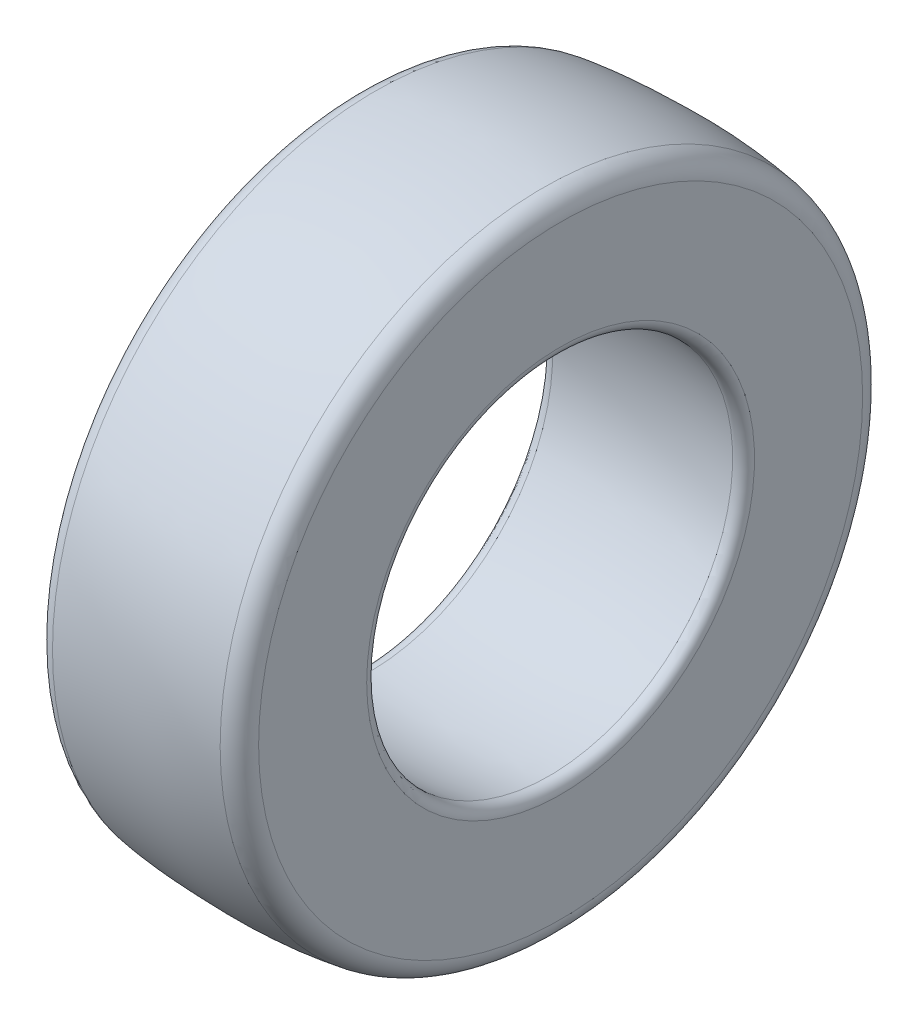
ISO-10303-21;
HEADER;
FILE_DESCRIPTION(('STEP AP214'),'2;1');
FILE_NAME('part.step','',(''),(''),'','','');
FILE_SCHEMA(('AUTOMOTIVE_DESIGN { 1 0 10303 214 1 1 1 1 }'));
ENDSEC;
DATA;
#1=APPLICATION_CONTEXT('core data for automotive mechanical design processes');
#2=APPLICATION_PROTOCOL_DEFINITION('international standard','automotive_design',2000,#1);
#3=PRODUCT_CONTEXT('',#1,'mechanical');
#4=PRODUCT('Part','Part','',(#3));
#5=PRODUCT_RELATED_PRODUCT_CATEGORY('part','',(#4));
#6=PRODUCT_DEFINITION_FORMATION('','',#4);
#7=PRODUCT_DEFINITION_CONTEXT('part definition',#1,'design');
#8=PRODUCT_DEFINITION('design','',#6,#7);
#9=PRODUCT_DEFINITION_SHAPE('','',#8);
#10=(LENGTH_UNIT() NAMED_UNIT(*) SI_UNIT(.MILLI.,.METRE.));
#11=(NAMED_UNIT(*) PLANE_ANGLE_UNIT() SI_UNIT($,.RADIAN.));
#12=(NAMED_UNIT(*) SI_UNIT($,.STERADIAN.) SOLID_ANGLE_UNIT());
#13=UNCERTAINTY_MEASURE_WITH_UNIT(LENGTH_MEASURE(1.E-05),#10,'distance_accuracy_value','');
#14=(GEOMETRIC_REPRESENTATION_CONTEXT(3) GLOBAL_UNCERTAINTY_ASSIGNED_CONTEXT((#13)) GLOBAL_UNIT_ASSIGNED_CONTEXT((#10,
#11,#12)) REPRESENTATION_CONTEXT('',''));
#15=CARTESIAN_POINT('',(0.,0.,0.));
#16=DIRECTION('',(0.,0.,1.));
#17=DIRECTION('',(1.,0.,0.));
#18=AXIS2_PLACEMENT_3D('',#15,#16,#17);
#19=CARTESIAN_POINT('',(8.03696229388294,0.273461296531756,0.));
#20=CARTESIAN_POINT('',(5.00041149086391,0.713704260185323,0.));
#21=CARTESIAN_POINT('',(1.53905645336523,0.9395684827717,0.));
#22=CARTESIAN_POINT('',(-5.70942025100693,0.635053509987881,0.));
#23=CARTESIAN_POINT('',(-8.04687623999241,0.284199065877852,0.));
#24=B_SPLINE_CURVE_WITH_KNOTS('',3,(#19,#20,#21,#22,#23),.UNSPECIFIED.,.F.,.F.,(4,1,4),
(0.0895013504530113,0.546617305205757,0.914231909505492),.UNSPECIFIED.);
#25=CARTESIAN_POINT('',(0.,-30.6972760772363,-2.44967934269345E-11));
#26=DIRECTION('',(-1.,0.,0.));
#27=AXIS1_PLACEMENT('',#25,#26);
#28=SURFACE_OF_REVOLUTION('',#24,#27);
#29=CARTESIAN_POINT('',(-8.04687623999241,-30.6972760772363,-2.44967934269345E-11));
#30=DIRECTION('',(-1.,0.,0.));
#31=DIRECTION('',(0.,0.,1.));
#32=AXIS2_PLACEMENT_3D('',#29,#30,#31);
#33=CIRCLE('',#32,30.9814751431141);
#34=CARTESIAN_POINT('',(-8.04687623999241,-30.6972760772363,30.9814751430896));
#35=VERTEX_POINT('',#34);
#36=EDGE_CURVE('E10',#35,#35,#33,.T.);
#37=ORIENTED_EDGE('',*,*,#36,.F.);
#38=EDGE_LOOP('',(#37));
#39=FACE_BOUND('',#38,.T.);
#40=CARTESIAN_POINT('',(8.03696229388294,-30.6972760772363,-2.44967934269345E-11));
#41=DIRECTION('',(-1.,0.,0.));
#42=DIRECTION('',(0.,0.,1.));
#43=AXIS2_PLACEMENT_3D('',#40,#41,#42);
#44=CIRCLE('',#43,30.970737373768);
#45=CARTESIAN_POINT('',(8.03696229388294,-30.6972760772363,30.9707373737435));
#46=VERTEX_POINT('',#45);
#47=EDGE_CURVE('E61',#46,#46,#44,.T.);
#48=ORIENTED_EDGE('',*,*,#47,.T.);
#49=EDGE_LOOP('',(#48));
#50=FACE_BOUND('',#49,.T.);
#51=ADVANCED_FACE('F32',(#39,#50),#28,.T.);
#52=CARTESIAN_POINT('',(-7.75000000000159,-30.6972760772363,-2.44967934269345E-11));
#53=DIRECTION('',(-1.,0.,0.));
#54=DIRECTION('',(0.,0.,1.));
#55=AXIS2_PLACEMENT_3D('',#52,#53,#54);
#56=TOROIDAL_SURFACE('',#55,29.0036317473598,2.);
#57=CARTESIAN_POINT('',(-9.75000000000159,-30.6972760772363,-2.44967934269345E-11));
#58=DIRECTION('',(-1.,0.,0.));
#59=DIRECTION('',(0.,0.,1.));
#60=AXIS2_PLACEMENT_3D('',#57,#58,#59);
#61=CIRCLE('',#60,29.0036317473598);
#62=CARTESIAN_POINT('',(-9.75000000000159,-30.6972760772363,29.0036317473353));
#63=VERTEX_POINT('',#62);
#64=EDGE_CURVE('E39',#63,#63,#61,.T.);
#65=ORIENTED_EDGE('',*,*,#64,.F.);
#66=EDGE_LOOP('',(#65));
#67=FACE_BOUND('',#66,.T.);
#68=ORIENTED_EDGE('',*,*,#36,.T.);
#69=EDGE_LOOP('',(#68));
#70=FACE_BOUND('',#69,.T.);
#71=ADVANCED_FACE('F87',(#67,#70),#56,.T.);
#72=CARTESIAN_POINT('',(-9.75000000000159,-1.69364432987645,0.));
#73=DIRECTION('',(1.,0.,0.));
#74=DIRECTION('',(0.,0.,-1.));
#75=AXIS2_PLACEMENT_3D('',#72,#73,#74);
#76=PLANE('',#75);
#77=CARTESIAN_POINT('',(-9.75000000000159,-30.6972760772363,-2.44967934269345E-11));
#78=DIRECTION('',(-1.,0.,0.));
#79=DIRECTION('',(0.,0.,1.));
#80=AXIS2_PLACEMENT_3D('',#77,#78,#79);
#81=CIRCLE('',#80,18.6232549003092);
#82=CARTESIAN_POINT('',(-9.75000000000159,-30.6972760772363,18.6232549002847));
#83=VERTEX_POINT('',#82);
#84=EDGE_CURVE('E43',#83,#83,#81,.T.);
#85=ORIENTED_EDGE('',*,*,#84,.F.);
#86=EDGE_LOOP('',(#85));
#87=FACE_BOUND('',#86,.T.);
#88=ORIENTED_EDGE('',*,*,#64,.T.);
#89=EDGE_LOOP('',(#88));
#90=FACE_BOUND('',#89,.T.);
#91=ADVANCED_FACE('F84',(#87,#90),#76,.F.);
#92=CARTESIAN_POINT('',(-8.7500000000016,-30.6972760772363,-2.44967934269345E-11));
#93=DIRECTION('',(-1.,0.,0.));
#94=DIRECTION('',(0.,0.,1.));
#95=AXIS2_PLACEMENT_3D('',#92,#93,#94);
#96=TOROIDAL_SURFACE('',#95,18.6232549003092,0.999999999999997);
#97=CARTESIAN_POINT('',(-8.63949791795001,-30.6972760772363,-2.44967934269345E-11));
#98=DIRECTION('',(-1.,0.,0.));
#99=DIRECTION('',(0.,0.,1.));
#100=AXIS2_PLACEMENT_3D('',#97,#98,#99);
#101=CIRCLE('',#100,17.6293790077238);
#102=CARTESIAN_POINT('',(-8.63949791795001,-30.6972760772363,17.6293790076993));
#103=VERTEX_POINT('',#102);
#104=EDGE_CURVE('E47',#103,#103,#101,.T.);
#105=ORIENTED_EDGE('',*,*,#104,.F.);
#106=EDGE_LOOP('',(#105));
#107=FACE_BOUND('',#106,.T.);
#108=ORIENTED_EDGE('',*,*,#84,.T.);
#109=EDGE_LOOP('',(#108));
#110=FACE_BOUND('',#109,.T.);
#111=ADVANCED_FACE('F79',(#107,#110),#96,.T.);
#112=CARTESIAN_POINT('',(-8.63949791795001,-13.0678970695124,0.));
#113=CARTESIAN_POINT('',(-5.9626586622051,-12.7702781079459,0.));
#114=CARTESIAN_POINT('',(1.01895096601607,-12.4807579289736,0.));
#115=CARTESIAN_POINT('',(5.40115706098064,-12.7298575540861,0.));
#116=CARTESIAN_POINT('',(8.64421147663579,-13.0748714856482,0.));
#117=B_SPLINE_CURVE_WITH_KNOTS('',3,(#112,#113,#114,#115,#116),.UNSPECIFIED.,.F.,.F.,(4,1,4),
(0.0573405456291309,0.473274059311417,0.946548118622834),.UNSPECIFIED.);
#118=CARTESIAN_POINT('',(0.,-30.6972760772363,-2.44967934269345E-11));
#119=DIRECTION('',(-1.,0.,0.));
#120=AXIS1_PLACEMENT('',#118,#119);
#121=SURFACE_OF_REVOLUTION('',#117,#120);
#122=CARTESIAN_POINT('',(8.64421147663579,-30.6972760772363,-2.44967934269345E-11));
#123=DIRECTION('',(-1.,0.,0.));
#124=DIRECTION('',(0.,0.,1.));
#125=AXIS2_PLACEMENT_3D('',#122,#123,#124);
#126=CIRCLE('',#125,17.6224045915881);
#127=CARTESIAN_POINT('',(8.64421147663579,-30.6972760772363,17.6224045915636));
#128=VERTEX_POINT('',#127);
#129=EDGE_CURVE('E52',#128,#128,#126,.T.);
#130=ORIENTED_EDGE('',*,*,#129,.F.);
#131=EDGE_LOOP('',(#130));
#132=FACE_BOUND('',#131,.T.);
#133=ORIENTED_EDGE('',*,*,#104,.T.);
#134=EDGE_LOOP('',(#133));
#135=FACE_BOUND('',#134,.T.);
#136=ADVANCED_FACE('F74',(#132,#135),#121,.T.);
#137=CARTESIAN_POINT('',(8.74999999999871,-30.6972760772363,-2.44967934269345E-11));
#138=DIRECTION('',(-1.,0.,0.));
#139=DIRECTION('',(0.,0.,1.));
#140=AXIS2_PLACEMENT_3D('',#137,#138,#139);
#141=TOROIDAL_SURFACE('',#140,18.6167932421291,1.);
#142=CARTESIAN_POINT('',(9.74999999999871,-30.6972760772363,-2.44967934269345E-11));
#143=DIRECTION('',(-1.,0.,0.));
#144=DIRECTION('',(0.,0.,1.));
#145=AXIS2_PLACEMENT_3D('',#142,#143,#144);
#146=CIRCLE('',#145,18.6167932421291);
#147=CARTESIAN_POINT('',(9.74999999999871,-30.6972760772363,18.6167932421046));
#148=VERTEX_POINT('',#147);
#149=EDGE_CURVE('E55',#148,#148,#146,.T.);
#150=ORIENTED_EDGE('',*,*,#149,.F.);
#151=EDGE_LOOP('',(#150));
#152=FACE_BOUND('',#151,.T.);
#153=ORIENTED_EDGE('',*,*,#129,.T.);
#154=EDGE_LOOP('',(#153));
#155=FACE_BOUND('',#154,.T.);
#156=ADVANCED_FACE('F78',(#152,#155),#141,.T.);
#157=CARTESIAN_POINT('',(9.74999999999871,-1.70584480457759,0.));
#158=DIRECTION('',(-1.,0.,0.));
#159=DIRECTION('',(0.,0.,1.));
#160=AXIS2_PLACEMENT_3D('',#157,#158,#159);
#161=PLANE('',#160);
#162=CARTESIAN_POINT('',(9.74999999999871,-30.6972760772363,-2.44967934269345E-11));
#163=DIRECTION('',(-1.,0.,0.));
#164=DIRECTION('',(0.,0.,1.));
#165=AXIS2_PLACEMENT_3D('',#162,#163,#164);
#166=CIRCLE('',#165,28.9914312726587);
#167=CARTESIAN_POINT('',(9.74999999999871,-30.6972760772363,28.9914312726342));
#168=VERTEX_POINT('',#167);
#169=EDGE_CURVE('E58',#168,#168,#166,.T.);
#170=ORIENTED_EDGE('',*,*,#169,.F.);
#171=EDGE_LOOP('',(#170));
#172=FACE_BOUND('',#171,.T.);
#173=ORIENTED_EDGE('',*,*,#149,.T.);
#174=EDGE_LOOP('',(#173));
#175=FACE_BOUND('',#174,.T.);
#176=ADVANCED_FACE('F103',(#172,#175),#161,.F.);
#177=CARTESIAN_POINT('',(7.74999999999871,-30.6972760772363,-2.44967934269345E-11));
#178=DIRECTION('',(-1.,0.,0.));
#179=DIRECTION('',(0.,0.,1.));
#180=AXIS2_PLACEMENT_3D('',#177,#178,#179);
#181=TOROIDAL_SURFACE('',#180,28.9914312726587,2.);
#182=ORIENTED_EDGE('',*,*,#47,.F.);
#183=EDGE_LOOP('',(#182));
#184=FACE_BOUND('',#183,.T.);
#185=ORIENTED_EDGE('',*,*,#169,.T.);
#186=EDGE_LOOP('',(#185));
#187=FACE_BOUND('',#186,.T.);
#188=ADVANCED_FACE('F100',(#184,#187),#181,.T.);
#189=CLOSED_SHELL('',(#51,#71,#91,#111,#136,#156,#176,#188));
#190=MANIFOLD_SOLID_BREP('B2',#189);
#191=ADVANCED_BREP_SHAPE_REPRESENTATION('',(#18,#190),#14);
#192=SHAPE_DEFINITION_REPRESENTATION(#9,#191);
ENDSEC;
END-ISO-10303-21;
